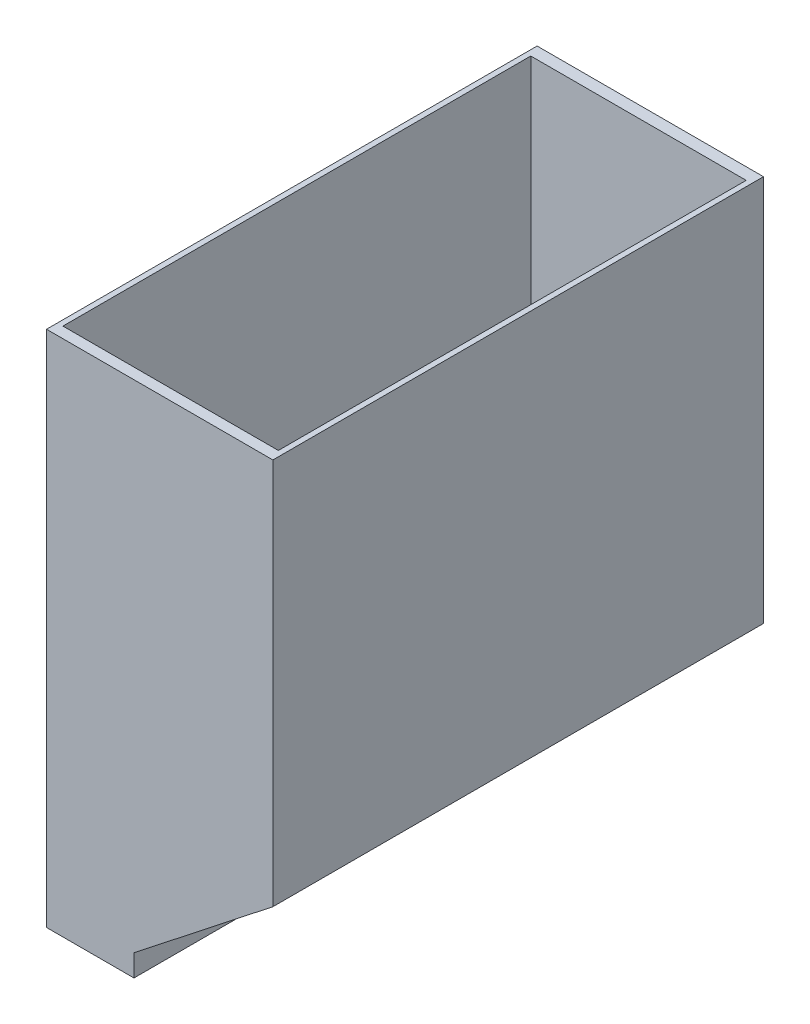
ISO-10303-21;
HEADER;
FILE_DESCRIPTION(('STEP AP214'),'2;1');
FILE_NAME('part.step','',(''),(''),'','','');
FILE_SCHEMA(('AUTOMOTIVE_DESIGN { 1 0 10303 214 1 1 1 1 }'));
ENDSEC;
DATA;
#1=APPLICATION_CONTEXT('core data for automotive mechanical design processes');
#2=APPLICATION_PROTOCOL_DEFINITION('international standard','automotive_design',2000,#1);
#3=PRODUCT_CONTEXT('',#1,'mechanical');
#4=PRODUCT('Part','Part','',(#3));
#5=PRODUCT_RELATED_PRODUCT_CATEGORY('part','',(#4));
#6=PRODUCT_DEFINITION_FORMATION('','',#4);
#7=PRODUCT_DEFINITION_CONTEXT('part definition',#1,'design');
#8=PRODUCT_DEFINITION('design','',#6,#7);
#9=PRODUCT_DEFINITION_SHAPE('','',#8);
#10=(LENGTH_UNIT() NAMED_UNIT(*) SI_UNIT(.MILLI.,.METRE.));
#11=(NAMED_UNIT(*) PLANE_ANGLE_UNIT() SI_UNIT($,.RADIAN.));
#12=(NAMED_UNIT(*) SI_UNIT($,.STERADIAN.) SOLID_ANGLE_UNIT());
#13=UNCERTAINTY_MEASURE_WITH_UNIT(LENGTH_MEASURE(1.E-05),#10,'distance_accuracy_value','');
#14=(GEOMETRIC_REPRESENTATION_CONTEXT(3) GLOBAL_UNCERTAINTY_ASSIGNED_CONTEXT((#13)) GLOBAL_UNIT_ASSIGNED_CONTEXT((#10,
#11,#12)) REPRESENTATION_CONTEXT('',''));
#15=CARTESIAN_POINT('',(0.,0.,0.));
#16=DIRECTION('',(0.,0.,1.));
#17=DIRECTION('',(1.,0.,0.));
#18=AXIS2_PLACEMENT_3D('',#15,#16,#17);
#19=CARTESIAN_POINT('',(-131.5,-288.29,285.));
#20=DIRECTION('',(0.,1.,0.));
#21=DIRECTION('',(0.,0.,1.));
#22=AXIS2_PLACEMENT_3D('',#19,#20,#21);
#23=PLANE('',#22);
#24=DIRECTION('',(1.,0.,0.));
#25=VECTOR('',#24,1.);
#26=CARTESIAN_POINT('',(-125.15,-288.29,-271.26));
#27=LINE('',#26,#25);
#28=CARTESIAN_POINT('',(-125.15,-288.29,-271.26));
#29=VERTEX_POINT('',#28);
#30=CARTESIAN_POINT('',(-40.1687584449143,-288.29,-271.26));
#31=VERTEX_POINT('',#30);
#32=EDGE_CURVE('E254',#29,#31,#27,.T.);
#33=ORIENTED_EDGE('',*,*,#32,.F.);
#34=DIRECTION('',(0.,0.,1.));
#35=VECTOR('',#34,1.);
#36=CARTESIAN_POINT('',(-125.15,-288.29,-271.26));
#37=LINE('',#36,#35);
#38=CARTESIAN_POINT('',(-125.15,-288.29,272.3));
#39=VERTEX_POINT('',#38);
#40=EDGE_CURVE('E282',#29,#39,#37,.T.);
#41=ORIENTED_EDGE('',*,*,#40,.T.);
#42=DIRECTION('',(1.,0.,0.));
#43=VECTOR('',#42,1.);
#44=CARTESIAN_POINT('',(-125.15,-288.29,272.3));
#45=LINE('',#44,#43);
#46=CARTESIAN_POINT('',(-40.1687584449143,-288.29,272.3));
#47=VERTEX_POINT('',#46);
#48=EDGE_CURVE('E268',#39,#47,#45,.T.);
#49=ORIENTED_EDGE('',*,*,#48,.T.);
#50=DIRECTION('',(0.,0.,1.));
#51=VECTOR('',#50,1.);
#52=CARTESIAN_POINT('',(-40.1687584449143,-288.29,-271.26));
#53=LINE('',#52,#51);
#54=EDGE_CURVE('E280',#31,#47,#53,.T.);
#55=ORIENTED_EDGE('',*,*,#54,.F.);
#56=EDGE_LOOP('',(#33,#41,#49,#55));
#57=FACE_BOUND('',#56,.T.);
#58=DIRECTION('',(0.,0.,-1.));
#59=VECTOR('',#58,1.);
#60=CARTESIAN_POINT('',(-36.25,-288.29,285.));
#61=LINE('',#60,#59);
#62=CARTESIAN_POINT('',(-36.2500000000001,-288.29,278.65));
#63=VERTEX_POINT('',#62);
#64=CARTESIAN_POINT('',(-36.25,-288.29,-278.65));
#65=VERTEX_POINT('',#64);
#66=EDGE_CURVE('E11',#63,#65,#61,.T.);
#67=ORIENTED_EDGE('',*,*,#66,.F.);
#68=DIRECTION('',(1.,0.,0.));
#69=VECTOR('',#68,1.);
#70=CARTESIAN_POINT('',(-131.5,-288.29,278.65));
#71=LINE('',#70,#69);
#72=CARTESIAN_POINT('',(-131.5,-288.29,278.65));
#73=VERTEX_POINT('',#72);
#74=EDGE_CURVE('E145',#73,#63,#71,.T.);
#75=ORIENTED_EDGE('',*,*,#74,.F.);
#76=DIRECTION('',(0.,0.,-1.));
#77=VECTOR('',#76,1.);
#78=CARTESIAN_POINT('',(-131.5,-288.29,285.));
#79=LINE('',#78,#77);
#80=CARTESIAN_POINT('',(-131.5,-288.29,-278.65));
#81=VERTEX_POINT('',#80);
#82=EDGE_CURVE('E155',#73,#81,#79,.T.);
#83=ORIENTED_EDGE('',*,*,#82,.T.);
#84=DIRECTION('',(1.,0.,0.));
#85=VECTOR('',#84,1.);
#86=CARTESIAN_POINT('',(-131.5,-288.29,-278.65));
#87=LINE('',#86,#85);
#88=EDGE_CURVE('E239',#81,#65,#87,.T.);
#89=ORIENTED_EDGE('',*,*,#88,.T.);
#90=EDGE_LOOP('',(#67,#75,#83,#89));
#91=FACE_BOUND('',#90,.T.);
#92=ADVANCED_FACE('F37',(#57,#91),#23,.F.);
#93=CARTESIAN_POINT('',(-36.25,-288.29,285.));
#94=DIRECTION('',(1.,0.,0.));
#95=DIRECTION('',(0.,1.,0.));
#96=AXIS2_PLACEMENT_3D('',#93,#94,#95);
#97=PLANE('',#96);
#98=DIRECTION('',(0.,0.,-1.));
#99=VECTOR('',#98,1.);
#100=CARTESIAN_POINT('',(-36.25,-313.69,285.));
#101=LINE('',#100,#99);
#102=CARTESIAN_POINT('',(-36.2500000000001,-313.69,278.65));
#103=VERTEX_POINT('',#102);
#104=CARTESIAN_POINT('',(-36.25,-313.69,-278.65));
#105=VERTEX_POINT('',#104);
#106=EDGE_CURVE('E44',#103,#105,#101,.T.);
#107=ORIENTED_EDGE('',*,*,#106,.F.);
#108=DIRECTION('',(0.,1.,0.));
#109=VECTOR('',#108,1.);
#110=CARTESIAN_POINT('',(-36.2500000000001,-313.69,278.65));
#111=LINE('',#110,#109);
#112=EDGE_CURVE('E152',#103,#63,#111,.T.);
#113=ORIENTED_EDGE('',*,*,#112,.T.);
#114=ORIENTED_EDGE('',*,*,#66,.T.);
#115=DIRECTION('',(0.,1.,0.));
#116=VECTOR('',#115,1.);
#117=CARTESIAN_POINT('',(-36.2500000000001,-313.69,-278.65));
#118=LINE('',#117,#116);
#119=EDGE_CURVE('E157',#105,#65,#118,.T.);
#120=ORIENTED_EDGE('',*,*,#119,.F.);
#121=EDGE_LOOP('',(#107,#113,#114,#120));
#122=FACE_BOUND('',#121,.T.);
#123=ADVANCED_FACE('F313',(#122),#97,.F.);
#124=CARTESIAN_POINT('',(-131.5,288.29,285.));
#125=DIRECTION('',(0.,-1.,0.));
#126=DIRECTION('',(0.,0.,-1.));
#127=AXIS2_PLACEMENT_3D('',#124,#125,#126);
#128=PLANE('',#127);
#129=DIRECTION('',(-1.,0.,0.));
#130=VECTOR('',#129,1.);
#131=CARTESIAN_POINT('',(-131.5,288.29,-285.));
#132=LINE('',#131,#130);
#133=CARTESIAN_POINT('',(131.5,288.29,-285.));
#134=VERTEX_POINT('',#133);
#135=CARTESIAN_POINT('',(-131.5,288.29,-285.));
#136=VERTEX_POINT('',#135);
#137=EDGE_CURVE('E209',#134,#136,#132,.T.);
#138=ORIENTED_EDGE('',*,*,#137,.T.);
#139=DIRECTION('',(0.,0.,-1.));
#140=VECTOR('',#139,1.);
#141=CARTESIAN_POINT('',(-131.5,288.29,285.));
#142=LINE('',#141,#140);
#143=CARTESIAN_POINT('',(-131.5,288.29,285.));
#144=VERTEX_POINT('',#143);
#145=EDGE_CURVE('E163',#144,#136,#142,.T.);
#146=ORIENTED_EDGE('',*,*,#145,.F.);
#147=DIRECTION('',(-1.,0.,0.));
#148=VECTOR('',#147,1.);
#149=CARTESIAN_POINT('',(-131.5,288.29,285.));
#150=LINE('',#149,#148);
#151=CARTESIAN_POINT('',(131.5,288.29,285.));
#152=VERTEX_POINT('',#151);
#153=EDGE_CURVE('E169',#152,#144,#150,.T.);
#154=ORIENTED_EDGE('',*,*,#153,.F.);
#155=DIRECTION('',(0.,0.,-1.));
#156=VECTOR('',#155,1.);
#157=CARTESIAN_POINT('',(131.5,288.29,285.));
#158=LINE('',#157,#156);
#159=EDGE_CURVE('E167',#152,#134,#158,.T.);
#160=ORIENTED_EDGE('',*,*,#159,.T.);
#161=EDGE_LOOP('',(#138,#146,#154,#160));
#162=FACE_BOUND('',#161,.T.);
#163=DIRECTION('',(-1.,0.,0.));
#164=VECTOR('',#163,1.);
#165=CARTESIAN_POINT('',(125.15,288.29,-271.26));
#166=LINE('',#165,#164);
#167=CARTESIAN_POINT('',(125.15,288.29,-271.26));
#168=VERTEX_POINT('',#167);
#169=CARTESIAN_POINT('',(-125.15,288.29,-271.26));
#170=VERTEX_POINT('',#169);
#171=EDGE_CURVE('E247',#168,#170,#166,.T.);
#172=ORIENTED_EDGE('',*,*,#171,.F.);
#173=DIRECTION('',(0.,0.,1.));
#174=VECTOR('',#173,1.);
#175=CARTESIAN_POINT('',(125.15,288.29,-271.26));
#176=LINE('',#175,#174);
#177=CARTESIAN_POINT('',(125.15,288.29,272.3));
#178=VERTEX_POINT('',#177);
#179=EDGE_CURVE('E206',#168,#178,#176,.T.);
#180=ORIENTED_EDGE('',*,*,#179,.T.);
#181=DIRECTION('',(-1.,0.,0.));
#182=VECTOR('',#181,1.);
#183=CARTESIAN_POINT('',(125.15,288.29,272.3));
#184=LINE('',#183,#182);
#185=CARTESIAN_POINT('',(-125.15,288.29,272.3));
#186=VERTEX_POINT('',#185);
#187=EDGE_CURVE('E246',#178,#186,#184,.T.);
#188=ORIENTED_EDGE('',*,*,#187,.T.);
#189=DIRECTION('',(0.,0.,1.));
#190=VECTOR('',#189,1.);
#191=CARTESIAN_POINT('',(-125.15,288.29,-271.26));
#192=LINE('',#191,#190);
#193=EDGE_CURVE('E219',#170,#186,#192,.T.);
#194=ORIENTED_EDGE('',*,*,#193,.F.);
#195=EDGE_LOOP('',(#172,#180,#188,#194));
#196=FACE_BOUND('',#195,.T.);
#197=ADVANCED_FACE('F230',(#162,#196),#128,.F.);
#198=CARTESIAN_POINT('',(-36.25,-313.69,285.));
#199=DIRECTION('',(0.,1.,0.));
#200=DIRECTION('',(-1.,0.,0.));
#201=AXIS2_PLACEMENT_3D('',#198,#199,#200);
#202=PLANE('',#201);
#203=DIRECTION('',(1.,0.,0.));
#204=VECTOR('',#203,1.);
#205=CARTESIAN_POINT('',(-36.25,-313.69,-285.));
#206=LINE('',#205,#204);
#207=CARTESIAN_POINT('',(-131.5,-313.69,-285.));
#208=VERTEX_POINT('',#207);
#209=CARTESIAN_POINT('',(-29.9,-313.69,-285.));
#210=VERTEX_POINT('',#209);
#211=EDGE_CURVE('E199',#208,#210,#206,.T.);
#212=ORIENTED_EDGE('',*,*,#211,.T.);
#213=DIRECTION('',(0.,0.,-1.));
#214=VECTOR('',#213,1.);
#215=CARTESIAN_POINT('',(-29.9,-313.69,285.));
#216=LINE('',#215,#214);
#217=CARTESIAN_POINT('',(-29.9,-313.69,285.));
#218=VERTEX_POINT('',#217);
#219=EDGE_CURVE('E183',#218,#210,#216,.T.);
#220=ORIENTED_EDGE('',*,*,#219,.F.);
#221=DIRECTION('',(1.,0.,0.));
#222=VECTOR('',#221,1.);
#223=CARTESIAN_POINT('',(-36.25,-313.69,285.));
#224=LINE('',#223,#222);
#225=CARTESIAN_POINT('',(-131.5,-313.69,285.));
#226=VERTEX_POINT('',#225);
#227=EDGE_CURVE('E213',#226,#218,#224,.T.);
#228=ORIENTED_EDGE('',*,*,#227,.F.);
#229=DIRECTION('',(0.,0.,-1.));
#230=VECTOR('',#229,1.);
#231=CARTESIAN_POINT('',(-131.5,-313.69,285.));
#232=LINE('',#231,#230);
#233=CARTESIAN_POINT('',(-131.5,-313.69,278.65));
#234=VERTEX_POINT('',#233);
#235=EDGE_CURVE('E151',#226,#234,#232,.T.);
#236=ORIENTED_EDGE('',*,*,#235,.T.);
#237=DIRECTION('',(1.,0.,0.));
#238=VECTOR('',#237,1.);
#239=CARTESIAN_POINT('',(-131.5,-313.69,278.65));
#240=LINE('',#239,#238);
#241=EDGE_CURVE('E146',#234,#103,#240,.T.);
#242=ORIENTED_EDGE('',*,*,#241,.T.);
#243=ORIENTED_EDGE('',*,*,#106,.T.);
#244=DIRECTION('',(1.,0.,0.));
#245=VECTOR('',#244,1.);
#246=CARTESIAN_POINT('',(-131.5,-313.69,-278.65));
#247=LINE('',#246,#245);
#248=CARTESIAN_POINT('',(-131.5,-313.69,-278.65));
#249=VERTEX_POINT('',#248);
#250=EDGE_CURVE('E243',#249,#105,#247,.T.);
#251=ORIENTED_EDGE('',*,*,#250,.F.);
#252=DIRECTION('',(0.,0.,1.));
#253=VECTOR('',#252,1.);
#254=CARTESIAN_POINT('',(-131.5,-313.69,-285.));
#255=LINE('',#254,#253);
#256=EDGE_CURVE('E236',#208,#249,#255,.T.);
#257=ORIENTED_EDGE('',*,*,#256,.F.);
#258=EDGE_LOOP('',(#212,#220,#228,#236,#242,#243,#251,#257));
#259=FACE_BOUND('',#258,.T.);
#260=ADVANCED_FACE('F320',(#259),#202,.F.);
#261=CARTESIAN_POINT('',(-29.9,-288.29,285.));
#262=DIRECTION('',(-1.,0.,0.));
#263=DIRECTION('',(0.,0.,1.));
#264=AXIS2_PLACEMENT_3D('',#261,#262,#263);
#265=PLANE('',#264);
#266=DIRECTION('',(0.,1.,0.));
#267=VECTOR('',#266,1.);
#268=CARTESIAN_POINT('',(-29.9,-288.29,-285.));
#269=LINE('',#268,#267);
#270=CARTESIAN_POINT('',(-29.9,-288.29,-285.));
#271=VERTEX_POINT('',#270);
#272=EDGE_CURVE('E191',#210,#271,#269,.T.);
#273=ORIENTED_EDGE('',*,*,#272,.T.);
#274=DIRECTION('',(0.,0.,-1.));
#275=VECTOR('',#274,1.);
#276=CARTESIAN_POINT('',(-29.9,-288.29,285.));
#277=LINE('',#276,#275);
#278=CARTESIAN_POINT('',(-29.9,-288.29,285.));
#279=VERTEX_POINT('',#278);
#280=EDGE_CURVE('E180',#279,#271,#277,.T.);
#281=ORIENTED_EDGE('',*,*,#280,.F.);
#282=DIRECTION('',(0.,1.,0.));
#283=VECTOR('',#282,1.);
#284=CARTESIAN_POINT('',(-29.9,-288.29,285.));
#285=LINE('',#284,#283);
#286=EDGE_CURVE('E192',#218,#279,#285,.T.);
#287=ORIENTED_EDGE('',*,*,#286,.F.);
#288=ORIENTED_EDGE('',*,*,#219,.T.);
#289=EDGE_LOOP('',(#273,#281,#287,#288));
#290=FACE_BOUND('',#289,.T.);
#291=ADVANCED_FACE('F189',(#290),#265,.F.);
#292=CARTESIAN_POINT('',(-29.9,-288.29,285.));
#293=DIRECTION('',(-0.618380501797163,0.785878842441434,0.));
#294=DIRECTION('',(-0.785878842441435,-0.618380501797163,0.));
#295=AXIS2_PLACEMENT_3D('',#292,#293,#294);
#296=PLANE('',#295);
#297=DIRECTION('',(0.785878842441434,0.618380501797163,0.));
#298=VECTOR('',#297,1.);
#299=CARTESIAN_POINT('',(-29.9,-288.29,-285.));
#300=LINE('',#299,#298);
#301=CARTESIAN_POINT('',(131.5,-161.29,-285.));
#302=VERTEX_POINT('',#301);
#303=EDGE_CURVE('E202',#271,#302,#300,.T.);
#304=ORIENTED_EDGE('',*,*,#303,.T.);
#305=DIRECTION('',(0.,0.,-1.));
#306=VECTOR('',#305,1.);
#307=CARTESIAN_POINT('',(131.5,-161.29,285.));
#308=LINE('',#307,#306);
#309=CARTESIAN_POINT('',(131.5,-161.29,285.));
#310=VERTEX_POINT('',#309);
#311=EDGE_CURVE('E177',#310,#302,#308,.T.);
#312=ORIENTED_EDGE('',*,*,#311,.F.);
#313=DIRECTION('',(0.785878842441434,0.618380501797163,0.));
#314=VECTOR('',#313,1.);
#315=CARTESIAN_POINT('',(-29.9,-288.29,285.));
#316=LINE('',#315,#314);
#317=EDGE_CURVE('E216',#279,#310,#316,.T.);
#318=ORIENTED_EDGE('',*,*,#317,.F.);
#319=ORIENTED_EDGE('',*,*,#280,.T.);
#320=EDGE_LOOP('',(#304,#312,#318,#319));
#321=FACE_BOUND('',#320,.T.);
#322=ADVANCED_FACE('F327',(#321),#296,.F.);
#323=CARTESIAN_POINT('',(131.5,288.29,285.));
#324=DIRECTION('',(-1.,0.,0.));
#325=DIRECTION('',(0.,-1.,0.));
#326=AXIS2_PLACEMENT_3D('',#323,#324,#325);
#327=PLANE('',#326);
#328=DIRECTION('',(0.,1.,0.));
#329=VECTOR('',#328,1.);
#330=CARTESIAN_POINT('',(131.5,288.29,-285.));
#331=LINE('',#330,#329);
#332=EDGE_CURVE('E204',#302,#134,#331,.T.);
#333=ORIENTED_EDGE('',*,*,#332,.T.);
#334=ORIENTED_EDGE('',*,*,#159,.F.);
#335=DIRECTION('',(0.,1.,0.));
#336=VECTOR('',#335,1.);
#337=CARTESIAN_POINT('',(131.5,288.29,285.));
#338=LINE('',#337,#336);
#339=EDGE_CURVE('E223',#310,#152,#338,.T.);
#340=ORIENTED_EDGE('',*,*,#339,.F.);
#341=ORIENTED_EDGE('',*,*,#311,.T.);
#342=EDGE_LOOP('',(#333,#334,#340,#341));
#343=FACE_BOUND('',#342,.T.);
#344=ADVANCED_FACE('F330',(#343),#327,.F.);
#345=CARTESIAN_POINT('',(-131.5,288.29,285.));
#346=DIRECTION('',(1.,0.,0.));
#347=DIRECTION('',(0.,1.,0.));
#348=AXIS2_PLACEMENT_3D('',#345,#346,#347);
#349=PLANE('',#348);
#350=DIRECTION('',(0.,-1.,0.));
#351=VECTOR('',#350,1.);
#352=CARTESIAN_POINT('',(-131.5,288.29,-285.));
#353=LINE('',#352,#351);
#354=EDGE_CURVE('E172',#136,#208,#353,.T.);
#355=ORIENTED_EDGE('',*,*,#354,.T.);
#356=ORIENTED_EDGE('',*,*,#256,.T.);
#357=DIRECTION('',(0.,1.,0.));
#358=VECTOR('',#357,1.);
#359=CARTESIAN_POINT('',(-131.5,-313.69,-278.65));
#360=LINE('',#359,#358);
#361=EDGE_CURVE('E161',#249,#81,#360,.T.);
#362=ORIENTED_EDGE('',*,*,#361,.T.);
#363=ORIENTED_EDGE('',*,*,#82,.F.);
#364=DIRECTION('',(0.,1.,0.));
#365=VECTOR('',#364,1.);
#366=CARTESIAN_POINT('',(-131.5,-313.69,278.65));
#367=LINE('',#366,#365);
#368=EDGE_CURVE('E141',#234,#73,#367,.T.);
#369=ORIENTED_EDGE('',*,*,#368,.F.);
#370=ORIENTED_EDGE('',*,*,#235,.F.);
#371=DIRECTION('',(0.,-1.,0.));
#372=VECTOR('',#371,1.);
#373=CARTESIAN_POINT('',(-131.5,288.29,285.));
#374=LINE('',#373,#372);
#375=EDGE_CURVE('E164',#144,#226,#374,.T.);
#376=ORIENTED_EDGE('',*,*,#375,.F.);
#377=ORIENTED_EDGE('',*,*,#145,.T.);
#378=EDGE_LOOP('',(#355,#356,#362,#363,#369,#370,#376,#377));
#379=FACE_BOUND('',#378,.T.);
#380=ADVANCED_FACE('F159',(#379),#349,.F.);
#381=CARTESIAN_POINT('',(0.,0.,285.));
#382=DIRECTION('',(0.,0.,-1.));
#383=DIRECTION('',(-1.,0.,0.));
#384=AXIS2_PLACEMENT_3D('',#381,#382,#383);
#385=PLANE('',#384);
#386=ORIENTED_EDGE('',*,*,#375,.T.);
#387=ORIENTED_EDGE('',*,*,#227,.T.);
#388=ORIENTED_EDGE('',*,*,#286,.T.);
#389=ORIENTED_EDGE('',*,*,#317,.T.);
#390=ORIENTED_EDGE('',*,*,#339,.T.);
#391=ORIENTED_EDGE('',*,*,#153,.T.);
#392=EDGE_LOOP('',(#386,#387,#388,#389,#390,#391));
#393=FACE_BOUND('',#392,.T.);
#394=ADVANCED_FACE('F226',(#393),#385,.F.);
#395=CARTESIAN_POINT('',(0.,0.,-285.));
#396=DIRECTION('',(0.,0.,-1.));
#397=DIRECTION('',(-1.,0.,0.));
#398=AXIS2_PLACEMENT_3D('',#395,#396,#397);
#399=PLANE('',#398);
#400=ORIENTED_EDGE('',*,*,#211,.F.);
#401=ORIENTED_EDGE('',*,*,#354,.F.);
#402=ORIENTED_EDGE('',*,*,#137,.F.);
#403=ORIENTED_EDGE('',*,*,#332,.F.);
#404=ORIENTED_EDGE('',*,*,#303,.F.);
#405=ORIENTED_EDGE('',*,*,#272,.F.);
#406=EDGE_LOOP('',(#400,#401,#402,#403,#404,#405));
#407=FACE_BOUND('',#406,.T.);
#408=ADVANCED_FACE('F197',(#407),#399,.T.);
#409=CARTESIAN_POINT('',(125.15,-158.20646640332,-271.26));
#410=DIRECTION('',(1.,0.,0.));
#411=DIRECTION('',(0.,1.,0.));
#412=AXIS2_PLACEMENT_3D('',#409,#410,#411);
#413=PLANE('',#412);
#414=DIRECTION('',(0.,1.,0.));
#415=VECTOR('',#414,1.);
#416=CARTESIAN_POINT('',(125.15,-158.20646640332,272.3));
#417=LINE('',#416,#415);
#418=CARTESIAN_POINT('',(125.15,-158.20646640332,272.3));
#419=VERTEX_POINT('',#418);
#420=EDGE_CURVE('E251',#419,#178,#417,.T.);
#421=ORIENTED_EDGE('',*,*,#420,.T.);
#422=ORIENTED_EDGE('',*,*,#179,.F.);
#423=DIRECTION('',(0.,1.,0.));
#424=VECTOR('',#423,1.);
#425=CARTESIAN_POINT('',(125.15,-158.20646640332,-271.26));
#426=LINE('',#425,#424);
#427=CARTESIAN_POINT('',(125.15,-158.20646640332,-271.26));
#428=VERTEX_POINT('',#427);
#429=EDGE_CURVE('E260',#428,#168,#426,.T.);
#430=ORIENTED_EDGE('',*,*,#429,.F.);
#431=DIRECTION('',(0.,0.,1.));
#432=VECTOR('',#431,1.);
#433=CARTESIAN_POINT('',(125.15,-158.20646640332,-271.26));
#434=LINE('',#433,#432);
#435=EDGE_CURVE('E278',#428,#419,#434,.T.);
#436=ORIENTED_EDGE('',*,*,#435,.T.);
#437=EDGE_LOOP('',(#421,#422,#430,#436));
#438=FACE_BOUND('',#437,.T.);
#439=ADVANCED_FACE('F295',(#438),#413,.F.);
#440=CARTESIAN_POINT('',(-40.1687584449143,-288.29,-271.26));
#441=DIRECTION('',(0.618380501797163,-0.785878842441434,0.));
#442=DIRECTION('',(0.785878842441434,0.618380501797163,0.));
#443=AXIS2_PLACEMENT_3D('',#440,#441,#442);
#444=PLANE('',#443);
#445=DIRECTION('',(0.785878842441434,0.618380501797163,0.));
#446=VECTOR('',#445,1.);
#447=CARTESIAN_POINT('',(-40.1687584449143,-288.29,272.3));
#448=LINE('',#447,#446);
#449=EDGE_CURVE('E271',#47,#419,#448,.T.);
#450=ORIENTED_EDGE('',*,*,#449,.T.);
#451=ORIENTED_EDGE('',*,*,#435,.F.);
#452=DIRECTION('',(0.785878842441434,0.618380501797163,0.));
#453=VECTOR('',#452,1.);
#454=CARTESIAN_POINT('',(-40.1687584449143,-288.29,-271.26));
#455=LINE('',#454,#453);
#456=EDGE_CURVE('E257',#31,#428,#455,.T.);
#457=ORIENTED_EDGE('',*,*,#456,.F.);
#458=ORIENTED_EDGE('',*,*,#54,.T.);
#459=EDGE_LOOP('',(#450,#451,#457,#458));
#460=FACE_BOUND('',#459,.T.);
#461=ADVANCED_FACE('F298',(#460),#444,.F.);
#462=CARTESIAN_POINT('',(-125.15,288.29,-271.26));
#463=DIRECTION('',(-1.,0.,0.));
#464=DIRECTION('',(0.,-1.,0.));
#465=AXIS2_PLACEMENT_3D('',#462,#463,#464);
#466=PLANE('',#465);
#467=DIRECTION('',(0.,-1.,0.));
#468=VECTOR('',#467,1.);
#469=CARTESIAN_POINT('',(-125.15,288.29,272.3));
#470=LINE('',#469,#468);
#471=EDGE_CURVE('E265',#186,#39,#470,.T.);
#472=ORIENTED_EDGE('',*,*,#471,.T.);
#473=ORIENTED_EDGE('',*,*,#40,.F.);
#474=DIRECTION('',(0.,-1.,0.));
#475=VECTOR('',#474,1.);
#476=CARTESIAN_POINT('',(-125.15,288.29,-271.26));
#477=LINE('',#476,#475);
#478=EDGE_CURVE('E250',#170,#29,#477,.T.);
#479=ORIENTED_EDGE('',*,*,#478,.F.);
#480=ORIENTED_EDGE('',*,*,#193,.T.);
#481=EDGE_LOOP('',(#472,#473,#479,#480));
#482=FACE_BOUND('',#481,.T.);
#483=ADVANCED_FACE('F289',(#482),#466,.F.);
#484=CARTESIAN_POINT('',(0.,0.,-271.26));
#485=DIRECTION('',(0.,0.,1.));
#486=DIRECTION('',(1.,0.,0.));
#487=AXIS2_PLACEMENT_3D('',#484,#485,#486);
#488=PLANE('',#487);
#489=ORIENTED_EDGE('',*,*,#171,.T.);
#490=ORIENTED_EDGE('',*,*,#478,.T.);
#491=ORIENTED_EDGE('',*,*,#32,.T.);
#492=ORIENTED_EDGE('',*,*,#456,.T.);
#493=ORIENTED_EDGE('',*,*,#429,.T.);
#494=EDGE_LOOP('',(#489,#490,#491,#492,#493));
#495=FACE_BOUND('',#494,.T.);
#496=ADVANCED_FACE('F301',(#495),#488,.T.);
#497=CARTESIAN_POINT('',(0.,0.,272.3));
#498=DIRECTION('',(0.,0.,1.));
#499=DIRECTION('',(1.,0.,0.));
#500=AXIS2_PLACEMENT_3D('',#497,#498,#499);
#501=PLANE('',#500);
#502=ORIENTED_EDGE('',*,*,#187,.F.);
#503=ORIENTED_EDGE('',*,*,#420,.F.);
#504=ORIENTED_EDGE('',*,*,#449,.F.);
#505=ORIENTED_EDGE('',*,*,#48,.F.);
#506=ORIENTED_EDGE('',*,*,#471,.F.);
#507=EDGE_LOOP('',(#502,#503,#504,#505,#506));
#508=FACE_BOUND('',#507,.T.);
#509=ADVANCED_FACE('F293',(#508),#501,.F.);
#510=CARTESIAN_POINT('',(-131.5,-313.69,-278.65));
#511=DIRECTION('',(0.,0.,-1.));
#512=DIRECTION('',(0.,1.,0.));
#513=AXIS2_PLACEMENT_3D('',#510,#511,#512);
#514=PLANE('',#513);
#515=ORIENTED_EDGE('',*,*,#119,.T.);
#516=ORIENTED_EDGE('',*,*,#88,.F.);
#517=ORIENTED_EDGE('',*,*,#361,.F.);
#518=ORIENTED_EDGE('',*,*,#250,.T.);
#519=EDGE_LOOP('',(#515,#516,#517,#518));
#520=FACE_BOUND('',#519,.T.);
#521=ADVANCED_FACE('F308',(#520),#514,.F.);
#522=CARTESIAN_POINT('',(-131.5,-313.69,278.65));
#523=DIRECTION('',(0.,0.,-1.));
#524=DIRECTION('',(0.,1.,0.));
#525=AXIS2_PLACEMENT_3D('',#522,#523,#524);
#526=PLANE('',#525);
#527=ORIENTED_EDGE('',*,*,#112,.F.);
#528=ORIENTED_EDGE('',*,*,#241,.F.);
#529=ORIENTED_EDGE('',*,*,#368,.T.);
#530=ORIENTED_EDGE('',*,*,#74,.T.);
#531=EDGE_LOOP('',(#527,#528,#529,#530));
#532=FACE_BOUND('',#531,.T.);
#533=ADVANCED_FACE('F144',(#532),#526,.T.);
#534=CLOSED_SHELL('',(#92,#123,#197,#260,#291,#322,#344,#380,#394,#408,#439,#461,#483,#496,#509,
#521,#533));
#535=MANIFOLD_SOLID_BREP('B2',#534);
#536=ADVANCED_BREP_SHAPE_REPRESENTATION('',(#18,#535),#14);
#537=SHAPE_DEFINITION_REPRESENTATION(#9,#536);
ENDSEC;
END-ISO-10303-21;
